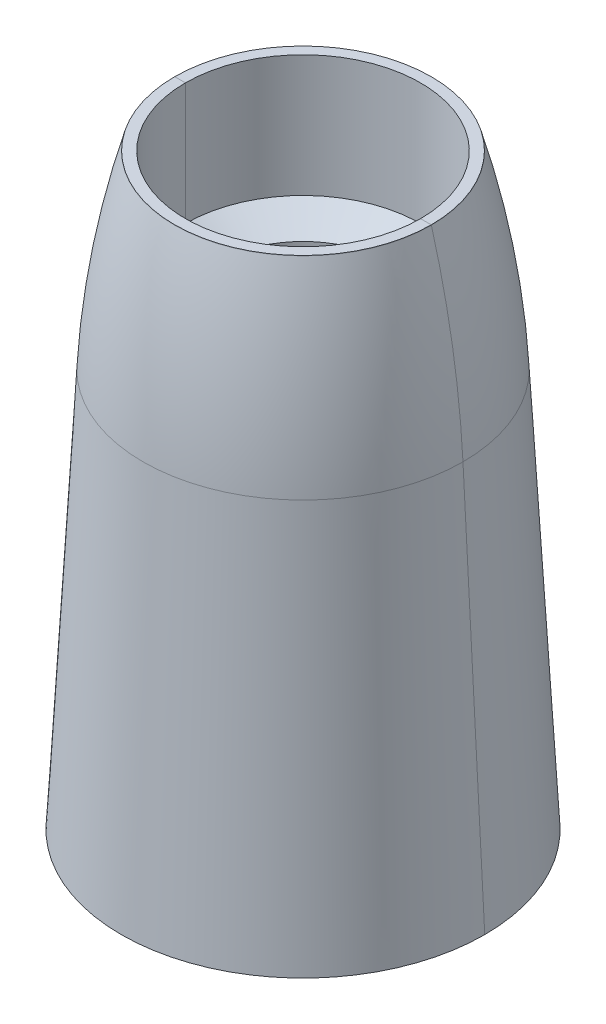
ISO-10303-21;
HEADER;
FILE_DESCRIPTION(('STEP AP214'),'2;1');
FILE_NAME('part.step','',(''),(''),'','','');
FILE_SCHEMA(('AUTOMOTIVE_DESIGN { 1 0 10303 214 1 1 1 1 }'));
ENDSEC;
DATA;
#1=APPLICATION_CONTEXT('core data for automotive mechanical design processes');
#2=APPLICATION_PROTOCOL_DEFINITION('international standard','automotive_design',2000,#1);
#3=PRODUCT_CONTEXT('',#1,'mechanical');
#4=PRODUCT('Part','Part','',(#3));
#5=PRODUCT_RELATED_PRODUCT_CATEGORY('part','',(#4));
#6=PRODUCT_DEFINITION_FORMATION('','',#4);
#7=PRODUCT_DEFINITION_CONTEXT('part definition',#1,'design');
#8=PRODUCT_DEFINITION('design','',#6,#7);
#9=PRODUCT_DEFINITION_SHAPE('','',#8);
#10=(LENGTH_UNIT() NAMED_UNIT(*) SI_UNIT(.MILLI.,.METRE.));
#11=(NAMED_UNIT(*) PLANE_ANGLE_UNIT() SI_UNIT($,.RADIAN.));
#12=(NAMED_UNIT(*) SI_UNIT($,.STERADIAN.) SOLID_ANGLE_UNIT());
#13=UNCERTAINTY_MEASURE_WITH_UNIT(LENGTH_MEASURE(1.E-05),#10,'distance_accuracy_value','');
#14=(GEOMETRIC_REPRESENTATION_CONTEXT(3) GLOBAL_UNCERTAINTY_ASSIGNED_CONTEXT((#13)) GLOBAL_UNIT_ASSIGNED_CONTEXT((#10,
#11,#12)) REPRESENTATION_CONTEXT('',''));
#15=CARTESIAN_POINT('',(0.,0.,0.));
#16=DIRECTION('',(0.,0.,1.));
#17=DIRECTION('',(1.,0.,0.));
#18=AXIS2_PLACEMENT_3D('',#15,#16,#17);
#19=CARTESIAN_POINT('',(0.,0.,0.));
#20=DIRECTION('',(0.,0.,1.));
#21=DIRECTION('',(1.,0.,0.));
#22=AXIS2_PLACEMENT_3D('',#19,#20,#21);
#23=PLANE('',#22);
#24=DIRECTION('',(-1.,0.,0.));
#25=VECTOR('',#24,1.);
#26=CARTESIAN_POINT('',(0.,0.,0.));
#27=LINE('',#26,#25);
#28=CARTESIAN_POINT('',(8.5,0.,0.));
#29=VERTEX_POINT('',#28);
#30=CARTESIAN_POINT('',(2.6,0.,0.));
#31=VERTEX_POINT('',#30);
#32=EDGE_CURVE('E192',#29,#31,#27,.T.);
#33=ORIENTED_EDGE('',*,*,#32,.F.);
#34=DIRECTION('',(-0.0545485545110783,0.998511119217384,0.));
#35=VECTOR('',#34,1.);
#36=CARTESIAN_POINT('',(0.,155.5924733372,0.));
#37=LINE('',#36,#35);
#38=CARTESIAN_POINT('',(7.48168897642754,18.6401800922559,0.));
#39=VERTEX_POINT('',#38);
#40=EDGE_CURVE('E198',#39,#29,#37,.F.);
#41=ORIENTED_EDGE('',*,*,#40,.F.);
#42=CARTESIAN_POINT('',(-32.9580113518765,16.4309636345572,0.));
#43=DIRECTION('',(0.,0.,1.));
#44=DIRECTION('',(1.,0.,0.));
#45=AXIS2_PLACEMENT_3D('',#42,#43,#44);
#46=CIRCLE('',#45,40.5);
#47=CARTESIAN_POINT('',(6.0039982347022,27.485908635567,0.));
#48=VERTEX_POINT('',#47);
#49=EDGE_CURVE('E63',#48,#39,#46,.F.);
#50=ORIENTED_EDGE('',*,*,#49,.F.);
#51=DIRECTION('',(-0.272961604963203,0.962024928063671,0.));
#52=VECTOR('',#51,1.);
#53=CARTESIAN_POINT('',(0.,48.6463790636788,0.));
#54=LINE('',#53,#52);
#55=CARTESIAN_POINT('',(6.,27.5,0.));
#56=VERTEX_POINT('',#55);
#57=EDGE_CURVE('E201',#56,#48,#54,.F.);
#58=ORIENTED_EDGE('',*,*,#57,.F.);
#59=DIRECTION('',(1.,0.,0.));
#60=VECTOR('',#59,1.);
#61=CARTESIAN_POINT('',(0.,27.5,0.));
#62=LINE('',#61,#60);
#63=CARTESIAN_POINT('',(5.5,27.5,0.));
#64=VERTEX_POINT('',#63);
#65=EDGE_CURVE('E208',#64,#56,#62,.T.);
#66=ORIENTED_EDGE('',*,*,#65,.F.);
#67=DIRECTION('',(0.,-1.,0.));
#68=VECTOR('',#67,1.);
#69=CARTESIAN_POINT('',(5.5,0.,0.));
#70=LINE('',#69,#68);
#71=CARTESIAN_POINT('',(5.5,21.8,0.));
#72=VERTEX_POINT('',#71);
#73=EDGE_CURVE('E211',#72,#64,#70,.F.);
#74=ORIENTED_EDGE('',*,*,#73,.F.);
#75=DIRECTION('',(0.88235294117647,0.470588235294118,0.));
#76=VECTOR('',#75,1.);
#77=CARTESIAN_POINT('',(0.,18.8666666666667,0.));
#78=LINE('',#77,#76);
#79=CARTESIAN_POINT('',(4.,21.,0.));
#80=VERTEX_POINT('',#79);
#81=EDGE_CURVE('E218',#80,#72,#78,.T.);
#82=ORIENTED_EDGE('',*,*,#81,.F.);
#83=DIRECTION('',(0.,-1.,0.));
#84=VECTOR('',#83,1.);
#85=CARTESIAN_POINT('',(4.,0.,0.));
#86=LINE('',#85,#84);
#87=CARTESIAN_POINT('',(4.,14.5,0.));
#88=VERTEX_POINT('',#87);
#89=EDGE_CURVE('E221',#88,#80,#86,.F.);
#90=ORIENTED_EDGE('',*,*,#89,.F.);
#91=DIRECTION('',(-0.882352941176471,0.470588235294117,0.));
#92=VECTOR('',#91,1.);
#93=CARTESIAN_POINT('',(0.,16.6333333333333,0.));
#94=LINE('',#93,#92);
#95=CARTESIAN_POINT('',(5.5,13.7,0.));
#96=VERTEX_POINT('',#95);
#97=EDGE_CURVE('E226',#96,#88,#94,.T.);
#98=ORIENTED_EDGE('',*,*,#97,.F.);
#99=DIRECTION('',(0.,-1.,0.));
#100=VECTOR('',#99,1.);
#101=CARTESIAN_POINT('',(5.5,0.,0.));
#102=LINE('',#101,#100);
#103=CARTESIAN_POINT('',(5.5,8.,0.));
#104=VERTEX_POINT('',#103);
#105=EDGE_CURVE('E231',#104,#96,#102,.F.);
#106=ORIENTED_EDGE('',*,*,#105,.F.);
#107=DIRECTION('',(1.,0.,0.));
#108=VECTOR('',#107,1.);
#109=CARTESIAN_POINT('',(0.,8.,0.));
#110=LINE('',#109,#108);
#111=CARTESIAN_POINT('',(2.6,8.,0.));
#112=VERTEX_POINT('',#111);
#113=EDGE_CURVE('E149',#112,#104,#110,.T.);
#114=ORIENTED_EDGE('',*,*,#113,.F.);
#115=DIRECTION('',(0.,-1.,0.));
#116=VECTOR('',#115,1.);
#117=CARTESIAN_POINT('',(2.6,0.,0.));
#118=LINE('',#117,#116);
#119=EDGE_CURVE('E150',#31,#112,#118,.F.);
#120=ORIENTED_EDGE('',*,*,#119,.F.);
#121=EDGE_LOOP('',(#33,#41,#50,#58,#66,#74,#82,#90,#98,#106,#114,#120));
#122=FACE_BOUND('',#121,.T.);
#123=ADVANCED_FACE('F48',(#122),#23,.T.);
#124=CARTESIAN_POINT('',(-2.6,0.,0.));
#125=VERTEX_POINT('',#124);
#126=CARTESIAN_POINT('',(-8.5,0.,0.));
#127=VERTEX_POINT('',#126);
#128=EDGE_CURVE('E156',#125,#127,#27,.T.);
#129=ORIENTED_EDGE('',*,*,#128,.F.);
#130=DIRECTION('',(0.,-1.,0.));
#131=VECTOR('',#130,1.);
#132=CARTESIAN_POINT('',(-2.6,0.,0.));
#133=LINE('',#132,#131);
#134=CARTESIAN_POINT('',(-2.6,8.,0.));
#135=VERTEX_POINT('',#134);
#136=EDGE_CURVE('E153',#135,#125,#133,.T.);
#137=ORIENTED_EDGE('',*,*,#136,.F.);
#138=CARTESIAN_POINT('',(-5.5,8.,0.));
#139=VERTEX_POINT('',#138);
#140=EDGE_CURVE('E139',#139,#135,#110,.T.);
#141=ORIENTED_EDGE('',*,*,#140,.F.);
#142=DIRECTION('',(0.,-1.,0.));
#143=VECTOR('',#142,1.);
#144=CARTESIAN_POINT('',(-5.5,0.,0.));
#145=LINE('',#144,#143);
#146=CARTESIAN_POINT('',(-5.5,13.7,0.));
#147=VERTEX_POINT('',#146);
#148=EDGE_CURVE('E234',#147,#139,#145,.T.);
#149=ORIENTED_EDGE('',*,*,#148,.F.);
#150=DIRECTION('',(-0.882352941176471,-0.470588235294117,0.));
#151=VECTOR('',#150,1.);
#152=CARTESIAN_POINT('',(0.,16.6333333333333,0.));
#153=LINE('',#152,#151);
#154=CARTESIAN_POINT('',(-4.,14.5,0.));
#155=VERTEX_POINT('',#154);
#156=EDGE_CURVE('E229',#155,#147,#153,.T.);
#157=ORIENTED_EDGE('',*,*,#156,.F.);
#158=DIRECTION('',(0.,-1.,0.));
#159=VECTOR('',#158,1.);
#160=CARTESIAN_POINT('',(-4.,0.,0.));
#161=LINE('',#160,#159);
#162=CARTESIAN_POINT('',(-4.,21.,0.));
#163=VERTEX_POINT('',#162);
#164=EDGE_CURVE('E224',#163,#155,#161,.T.);
#165=ORIENTED_EDGE('',*,*,#164,.F.);
#166=DIRECTION('',(0.88235294117647,-0.470588235294118,0.));
#167=VECTOR('',#166,1.);
#168=CARTESIAN_POINT('',(0.,18.8666666666667,0.));
#169=LINE('',#168,#167);
#170=CARTESIAN_POINT('',(-5.5,21.8,0.));
#171=VERTEX_POINT('',#170);
#172=EDGE_CURVE('E216',#171,#163,#169,.T.);
#173=ORIENTED_EDGE('',*,*,#172,.F.);
#174=DIRECTION('',(0.,-1.,0.));
#175=VECTOR('',#174,1.);
#176=CARTESIAN_POINT('',(-5.5,0.,0.));
#177=LINE('',#176,#175);
#178=CARTESIAN_POINT('',(-5.5,27.5,0.));
#179=VERTEX_POINT('',#178);
#180=EDGE_CURVE('E214',#179,#171,#177,.T.);
#181=ORIENTED_EDGE('',*,*,#180,.F.);
#182=CARTESIAN_POINT('',(-6.,27.5,0.));
#183=VERTEX_POINT('',#182);
#184=EDGE_CURVE('E209',#183,#179,#62,.T.);
#185=ORIENTED_EDGE('',*,*,#184,.F.);
#186=DIRECTION('',(-0.272961604963203,-0.962024928063671,0.));
#187=VECTOR('',#186,1.);
#188=CARTESIAN_POINT('',(0.,48.6463790636788,0.));
#189=LINE('',#188,#187);
#190=CARTESIAN_POINT('',(-6.0039982347022,27.485908635567,0.));
#191=VERTEX_POINT('',#190);
#192=EDGE_CURVE('E206',#191,#183,#189,.F.);
#193=ORIENTED_EDGE('',*,*,#192,.F.);
#194=CARTESIAN_POINT('',(32.9580113518765,16.4309636345572,0.));
#195=DIRECTION('',(0.,0.,1.));
#196=DIRECTION('',(1.,0.,0.));
#197=AXIS2_PLACEMENT_3D('',#194,#195,#196);
#198=CIRCLE('',#197,40.5);
#199=CARTESIAN_POINT('',(-7.48168897642754,18.6401800922559,0.));
#200=VERTEX_POINT('',#199);
#201=EDGE_CURVE('E71',#200,#191,#198,.F.);
#202=ORIENTED_EDGE('',*,*,#201,.F.);
#203=DIRECTION('',(-0.0545485545110783,-0.998511119217384,0.));
#204=VECTOR('',#203,1.);
#205=CARTESIAN_POINT('',(0.,155.5924733372,0.));
#206=LINE('',#205,#204);
#207=EDGE_CURVE('E197',#127,#200,#206,.F.);
#208=ORIENTED_EDGE('',*,*,#207,.F.);
#209=EDGE_LOOP('',(#129,#137,#141,#149,#157,#165,#173,#181,#185,#193,#202,#208));
#210=FACE_BOUND('',#209,.T.);
#211=ADVANCED_FACE('F154',(#210),#23,.T.);
#212=CARTESIAN_POINT('',(0.,8.,-2.6));
#213=DIRECTION('',(0.,1.,0.));
#214=DIRECTION('',(0.,0.,1.));
#215=AXIS2_PLACEMENT_3D('',#212,#213,#214);
#216=PLANE('',#215);
#217=CARTESIAN_POINT('',(0.,8.,0.));
#218=DIRECTION('',(0.,-1.,0.));
#219=DIRECTION('',(0.,0.,-1.));
#220=AXIS2_PLACEMENT_3D('',#217,#218,#219);
#221=CIRCLE('',#220,5.5);
#222=EDGE_CURVE('E146',#139,#104,#221,.T.);
#223=ORIENTED_EDGE('',*,*,#222,.F.);
#224=ORIENTED_EDGE('',*,*,#140,.T.);
#225=CARTESIAN_POINT('',(0.,8.,0.));
#226=DIRECTION('',(0.,-1.,0.));
#227=DIRECTION('',(0.,0.,-1.));
#228=AXIS2_PLACEMENT_3D('',#225,#226,#227);
#229=CIRCLE('',#228,2.6);
#230=EDGE_CURVE('E144',#135,#112,#229,.T.);
#231=ORIENTED_EDGE('',*,*,#230,.T.);
#232=ORIENTED_EDGE('',*,*,#113,.T.);
#233=EDGE_LOOP('',(#223,#224,#231,#232));
#234=FACE_BOUND('',#233,.T.);
#235=ADVANCED_FACE('F141',(#234),#216,.T.);
#236=CARTESIAN_POINT('',(0.,0.,0.));
#237=DIRECTION('',(0.,-1.,0.));
#238=DIRECTION('',(0.,0.,-1.));
#239=AXIS2_PLACEMENT_3D('',#236,#237,#238);
#240=CYLINDRICAL_SURFACE('',#239,5.5);
#241=CARTESIAN_POINT('',(0.,13.7,0.));
#242=DIRECTION('',(0.,-1.,0.));
#243=DIRECTION('',(0.,0.,-1.));
#244=AXIS2_PLACEMENT_3D('',#241,#242,#243);
#245=CIRCLE('',#244,5.5);
#246=EDGE_CURVE('E165',#147,#96,#245,.T.);
#247=ORIENTED_EDGE('',*,*,#246,.F.);
#248=ORIENTED_EDGE('',*,*,#148,.T.);
#249=ORIENTED_EDGE('',*,*,#222,.T.);
#250=ORIENTED_EDGE('',*,*,#105,.T.);
#251=EDGE_LOOP('',(#247,#248,#249,#250));
#252=FACE_BOUND('',#251,.T.);
#253=ADVANCED_FACE('F247',(#252),#240,.F.);
#254=CARTESIAN_POINT('',(0.,14.5,0.));
#255=DIRECTION('',(0.,-1.,0.));
#256=DIRECTION('',(0.,0.,-1.));
#257=AXIS2_PLACEMENT_3D('',#254,#255,#256);
#258=CONICAL_SURFACE('',#257,4.,1.08083900054117);
#259=CARTESIAN_POINT('',(0.,14.5,0.));
#260=DIRECTION('',(0.,-1.,0.));
#261=DIRECTION('',(0.,0.,-1.));
#262=AXIS2_PLACEMENT_3D('',#259,#260,#261);
#263=CIRCLE('',#262,4.);
#264=EDGE_CURVE('E174',#155,#88,#263,.T.);
#265=ORIENTED_EDGE('',*,*,#264,.F.);
#266=ORIENTED_EDGE('',*,*,#156,.T.);
#267=ORIENTED_EDGE('',*,*,#246,.T.);
#268=ORIENTED_EDGE('',*,*,#97,.T.);
#269=EDGE_LOOP('',(#265,#266,#267,#268));
#270=FACE_BOUND('',#269,.T.);
#271=ADVANCED_FACE('F253',(#270),#258,.F.);
#272=CARTESIAN_POINT('',(0.,0.,0.));
#273=DIRECTION('',(0.,-1.,0.));
#274=DIRECTION('',(0.,0.,-1.));
#275=AXIS2_PLACEMENT_3D('',#272,#273,#274);
#276=CYLINDRICAL_SURFACE('',#275,4.);
#277=CARTESIAN_POINT('',(0.,21.,0.));
#278=DIRECTION('',(0.,-1.,0.));
#279=DIRECTION('',(0.,0.,-1.));
#280=AXIS2_PLACEMENT_3D('',#277,#278,#279);
#281=CIRCLE('',#280,4.);
#282=EDGE_CURVE('E177',#163,#80,#281,.T.);
#283=ORIENTED_EDGE('',*,*,#282,.F.);
#284=ORIENTED_EDGE('',*,*,#164,.T.);
#285=ORIENTED_EDGE('',*,*,#264,.T.);
#286=ORIENTED_EDGE('',*,*,#89,.T.);
#287=EDGE_LOOP('',(#283,#284,#285,#286));
#288=FACE_BOUND('',#287,.T.);
#289=ADVANCED_FACE('F261',(#288),#276,.F.);
#290=CARTESIAN_POINT('',(0.,21.8,0.));
#291=DIRECTION('',(0.,1.,0.));
#292=DIRECTION('',(0.,0.,1.));
#293=AXIS2_PLACEMENT_3D('',#290,#291,#292);
#294=CONICAL_SURFACE('',#293,5.5,1.08083900054117);
#295=ORIENTED_EDGE('',*,*,#282,.T.);
#296=ORIENTED_EDGE('',*,*,#81,.T.);
#297=CARTESIAN_POINT('',(0.,21.8,0.));
#298=DIRECTION('',(0.,-1.,0.));
#299=DIRECTION('',(0.,0.,-1.));
#300=AXIS2_PLACEMENT_3D('',#297,#298,#299);
#301=CIRCLE('',#300,5.5);
#302=EDGE_CURVE('E180',#171,#72,#301,.T.);
#303=ORIENTED_EDGE('',*,*,#302,.F.);
#304=ORIENTED_EDGE('',*,*,#172,.T.);
#305=EDGE_LOOP('',(#295,#296,#303,#304));
#306=FACE_BOUND('',#305,.T.);
#307=ADVANCED_FACE('F265',(#306),#294,.F.);
#308=CARTESIAN_POINT('',(0.,0.,0.));
#309=DIRECTION('',(0.,-1.,0.));
#310=DIRECTION('',(0.,0.,-1.));
#311=AXIS2_PLACEMENT_3D('',#308,#309,#310);
#312=CYLINDRICAL_SURFACE('',#311,5.5);
#313=CARTESIAN_POINT('',(0.,27.5,0.));
#314=DIRECTION('',(0.,-1.,0.));
#315=DIRECTION('',(0.,0.,-1.));
#316=AXIS2_PLACEMENT_3D('',#313,#314,#315);
#317=CIRCLE('',#316,5.5);
#318=EDGE_CURVE('E183',#179,#64,#317,.T.);
#319=ORIENTED_EDGE('',*,*,#318,.F.);
#320=ORIENTED_EDGE('',*,*,#180,.T.);
#321=ORIENTED_EDGE('',*,*,#302,.T.);
#322=ORIENTED_EDGE('',*,*,#73,.T.);
#323=EDGE_LOOP('',(#319,#320,#321,#322));
#324=FACE_BOUND('',#323,.T.);
#325=ADVANCED_FACE('F269',(#324),#312,.F.);
#326=CARTESIAN_POINT('',(0.,27.5,-5.5));
#327=DIRECTION('',(0.,1.,0.));
#328=DIRECTION('',(0.,0.,1.));
#329=AXIS2_PLACEMENT_3D('',#326,#327,#328);
#330=PLANE('',#329);
#331=CARTESIAN_POINT('',(0.,27.5,0.));
#332=DIRECTION('',(0.,-1.,0.));
#333=DIRECTION('',(0.,0.,-1.));
#334=AXIS2_PLACEMENT_3D('',#331,#332,#333);
#335=CIRCLE('',#334,6.);
#336=EDGE_CURVE('E186',#183,#56,#335,.T.);
#337=ORIENTED_EDGE('',*,*,#336,.F.);
#338=ORIENTED_EDGE('',*,*,#184,.T.);
#339=ORIENTED_EDGE('',*,*,#318,.T.);
#340=ORIENTED_EDGE('',*,*,#65,.T.);
#341=EDGE_LOOP('',(#337,#338,#339,#340));
#342=FACE_BOUND('',#341,.T.);
#343=ADVANCED_FACE('F273',(#342),#330,.T.);
#344=CARTESIAN_POINT('',(0.,0.,0.));
#345=DIRECTION('',(0.,-1.,0.));
#346=DIRECTION('',(0.,0.,-1.));
#347=AXIS2_PLACEMENT_3D('',#344,#345,#346);
#348=CYLINDRICAL_SURFACE('',#347,2.6);
#349=ORIENTED_EDGE('',*,*,#230,.F.);
#350=ORIENTED_EDGE('',*,*,#136,.T.);
#351=CARTESIAN_POINT('',(0.,0.,0.));
#352=DIRECTION('',(0.,-1.,0.));
#353=DIRECTION('',(0.,0.,-1.));
#354=AXIS2_PLACEMENT_3D('',#351,#352,#353);
#355=CIRCLE('',#354,2.6);
#356=EDGE_CURVE('E12',#125,#31,#355,.T.);
#357=ORIENTED_EDGE('',*,*,#356,.T.);
#358=ORIENTED_EDGE('',*,*,#119,.T.);
#359=EDGE_LOOP('',(#349,#350,#357,#358));
#360=FACE_BOUND('',#359,.T.);
#361=ADVANCED_FACE('F161',(#360),#348,.F.);
#362=CARTESIAN_POINT('',(0.,0.,0.));
#363=DIRECTION('',(0.,-1.,0.));
#364=DIRECTION('',(0.,0.,-1.));
#365=AXIS2_PLACEMENT_3D('',#362,#363,#364);
#366=CONICAL_SURFACE('',#365,8.5,0.0545756427424007);
#367=CARTESIAN_POINT('',(0.,0.,0.));
#368=DIRECTION('',(0.,-1.,0.));
#369=DIRECTION('',(0.,0.,-1.));
#370=AXIS2_PLACEMENT_3D('',#367,#368,#369);
#371=CIRCLE('',#370,8.5);
#372=EDGE_CURVE('E56',#127,#29,#371,.T.);
#373=ORIENTED_EDGE('',*,*,#372,.F.);
#374=ORIENTED_EDGE('',*,*,#207,.T.);
#375=CARTESIAN_POINT('',(0.,18.6401800922559,0.));
#376=DIRECTION('',(0.,1.,0.));
#377=DIRECTION('',(0.,0.,1.));
#378=AXIS2_PLACEMENT_3D('',#375,#376,#377);
#379=CIRCLE('',#378,7.48168897642754);
#380=EDGE_CURVE('E163',#200,#39,#379,.F.);
#381=ORIENTED_EDGE('',*,*,#380,.T.);
#382=ORIENTED_EDGE('',*,*,#40,.T.);
#383=EDGE_LOOP('',(#373,#374,#381,#382));
#384=FACE_BOUND('',#383,.T.);
#385=ADVANCED_FACE('F196',(#384),#366,.T.);
#386=CARTESIAN_POINT('',(0.,23.1453552561219,0.));
#387=DIRECTION('',(0.,-1.,0.));
#388=DIRECTION('',(0.,0.,-1.));
#389=AXIS2_PLACEMENT_3D('',#386,#387,#388);
#390=CONICAL_SURFACE('',#389,7.23557174420211,0.276470204640159);
#391=CARTESIAN_POINT('',(0.,27.485908635567,0.));
#392=DIRECTION('',(0.,1.,0.));
#393=DIRECTION('',(0.,0.,1.));
#394=AXIS2_PLACEMENT_3D('',#391,#392,#393);
#395=CIRCLE('',#394,6.0039982347022);
#396=EDGE_CURVE('E168',#48,#191,#395,.T.);
#397=ORIENTED_EDGE('',*,*,#396,.T.);
#398=ORIENTED_EDGE('',*,*,#192,.T.);
#399=ORIENTED_EDGE('',*,*,#336,.T.);
#400=ORIENTED_EDGE('',*,*,#57,.T.);
#401=EDGE_LOOP('',(#397,#398,#399,#400));
#402=FACE_BOUND('',#401,.T.);
#403=ADVANCED_FACE('F240',(#402),#390,.T.);
#404=CARTESIAN_POINT('',(0.,16.4309636345572,0.));
#405=DIRECTION('',(0.,1.,0.));
#406=DIRECTION('',(0.,0.,1.));
#407=AXIS2_PLACEMENT_3D('',#404,#405,#406);
#408=DEGENERATE_TOROIDAL_SURFACE('',#407,32.9580113518765,40.5,.F.);
#409=ORIENTED_EDGE('',*,*,#396,.F.);
#410=ORIENTED_EDGE('',*,*,#49,.T.);
#411=ORIENTED_EDGE('',*,*,#380,.F.);
#412=ORIENTED_EDGE('',*,*,#201,.T.);
#413=EDGE_LOOP('',(#409,#410,#411,#412));
#414=FACE_BOUND('',#413,.T.);
#415=ADVANCED_FACE('F50',(#414),#408,.F.);
#416=CARTESIAN_POINT('',(0.,0.,-2.6));
#417=DIRECTION('',(0.,-1.,0.));
#418=DIRECTION('',(0.,0.,-1.));
#419=AXIS2_PLACEMENT_3D('',#416,#417,#418);
#420=PLANE('',#419);
#421=ORIENTED_EDGE('',*,*,#372,.T.);
#422=ORIENTED_EDGE('',*,*,#32,.T.);
#423=ORIENTED_EDGE('',*,*,#356,.F.);
#424=ORIENTED_EDGE('',*,*,#128,.T.);
#425=EDGE_LOOP('',(#421,#422,#423,#424));
#426=FACE_BOUND('',#425,.T.);
#427=ADVANCED_FACE('F191',(#426),#420,.T.);
#428=CLOSED_SHELL('',(#123,#211,#235,#253,#271,#289,#307,#325,#343,#361,#385,#403,#415,#427));
#429=MANIFOLD_SOLID_BREP('B2',#428);
#430=CARTESIAN_POINT('',(0.,0.,0.));
#431=DIRECTION('',(0.,0.,1.));
#432=DIRECTION('',(1.,0.,0.));
#433=AXIS2_PLACEMENT_3D('',#430,#431,#432);
#434=PLANE('',#433);
#435=DIRECTION('',(-1.,0.,0.));
#436=VECTOR('',#435,1.);
#437=CARTESIAN_POINT('',(0.,0.,0.));
#438=LINE('',#437,#436);
#439=CARTESIAN_POINT('',(8.5,0.,0.));
#440=VERTEX_POINT('',#439);
#441=CARTESIAN_POINT('',(2.6,0.,0.));
#442=VERTEX_POINT('',#441);
#443=EDGE_CURVE('E584',#440,#442,#438,.T.);
#444=ORIENTED_EDGE('',*,*,#443,.T.);
#445=DIRECTION('',(0.,-1.,0.));
#446=VECTOR('',#445,1.);
#447=CARTESIAN_POINT('',(2.6,0.,0.));
#448=LINE('',#447,#446);
#449=CARTESIAN_POINT('',(2.6,8.,0.));
#450=VERTEX_POINT('',#449);
#451=EDGE_CURVE('E431',#442,#450,#448,.F.);
#452=ORIENTED_EDGE('',*,*,#451,.T.);
#453=DIRECTION('',(1.,0.,0.));
#454=VECTOR('',#453,1.);
#455=CARTESIAN_POINT('',(0.,8.,0.));
#456=LINE('',#455,#454);
#457=CARTESIAN_POINT('',(5.5,8.,0.));
#458=VERTEX_POINT('',#457);
#459=EDGE_CURVE('E539',#450,#458,#456,.T.);
#460=ORIENTED_EDGE('',*,*,#459,.T.);
#461=DIRECTION('',(0.,-1.,0.));
#462=VECTOR('',#461,1.);
#463=CARTESIAN_POINT('',(5.5,0.,0.));
#464=LINE('',#463,#462);
#465=CARTESIAN_POINT('',(5.5,13.7,0.));
#466=VERTEX_POINT('',#465);
#467=EDGE_CURVE('E581',#458,#466,#464,.F.);
#468=ORIENTED_EDGE('',*,*,#467,.T.);
#469=DIRECTION('',(-0.882352941176471,0.470588235294117,0.));
#470=VECTOR('',#469,1.);
#471=CARTESIAN_POINT('',(0.,16.6333333333333,0.));
#472=LINE('',#471,#470);
#473=CARTESIAN_POINT('',(4.,14.5,0.));
#474=VERTEX_POINT('',#473);
#475=EDGE_CURVE('E578',#466,#474,#472,.T.);
#476=ORIENTED_EDGE('',*,*,#475,.T.);
#477=DIRECTION('',(0.,-1.,0.));
#478=VECTOR('',#477,1.);
#479=CARTESIAN_POINT('',(4.,0.,0.));
#480=LINE('',#479,#478);
#481=CARTESIAN_POINT('',(4.,21.,0.));
#482=VERTEX_POINT('',#481);
#483=EDGE_CURVE('E577',#474,#482,#480,.F.);
#484=ORIENTED_EDGE('',*,*,#483,.T.);
#485=DIRECTION('',(0.88235294117647,0.470588235294118,0.));
#486=VECTOR('',#485,1.);
#487=CARTESIAN_POINT('',(0.,18.8666666666667,0.));
#488=LINE('',#487,#486);
#489=CARTESIAN_POINT('',(5.5,21.8,0.));
#490=VERTEX_POINT('',#489);
#491=EDGE_CURVE('E573',#482,#490,#488,.T.);
#492=ORIENTED_EDGE('',*,*,#491,.T.);
#493=DIRECTION('',(0.,-1.,0.));
#494=VECTOR('',#493,1.);
#495=CARTESIAN_POINT('',(5.5,0.,0.));
#496=LINE('',#495,#494);
#497=CARTESIAN_POINT('',(5.5,27.5,0.));
#498=VERTEX_POINT('',#497);
#499=EDGE_CURVE('E569',#490,#498,#496,.F.);
#500=ORIENTED_EDGE('',*,*,#499,.T.);
#501=DIRECTION('',(1.,0.,0.));
#502=VECTOR('',#501,1.);
#503=CARTESIAN_POINT('',(0.,27.5,0.));
#504=LINE('',#503,#502);
#505=CARTESIAN_POINT('',(6.,27.5,0.));
#506=VERTEX_POINT('',#505);
#507=EDGE_CURVE('E562',#498,#506,#504,.T.);
#508=ORIENTED_EDGE('',*,*,#507,.T.);
#509=DIRECTION('',(-0.272961604963203,0.962024928063671,0.));
#510=VECTOR('',#509,1.);
#511=CARTESIAN_POINT('',(0.,48.6463790636788,0.));
#512=LINE('',#511,#510);
#513=CARTESIAN_POINT('',(6.0039982347022,27.485908635567,0.));
#514=VERTEX_POINT('',#513);
#515=EDGE_CURVE('E560',#506,#514,#512,.F.);
#516=ORIENTED_EDGE('',*,*,#515,.T.);
#517=CARTESIAN_POINT('',(-32.9580113518765,16.4309636345572,0.));
#518=DIRECTION('',(0.,0.,1.));
#519=DIRECTION('',(1.,0.,0.));
#520=AXIS2_PLACEMENT_3D('',#517,#518,#519);
#521=CIRCLE('',#520,40.5);
#522=CARTESIAN_POINT('',(7.48168897642754,18.6401800922559,0.));
#523=VERTEX_POINT('',#522);
#524=EDGE_CURVE('E436',#514,#523,#521,.F.);
#525=ORIENTED_EDGE('',*,*,#524,.T.);
#526=DIRECTION('',(-0.0545485545110783,0.998511119217384,0.));
#527=VECTOR('',#526,1.);
#528=CARTESIAN_POINT('',(0.,155.5924733372,0.));
#529=LINE('',#528,#527);
#530=EDGE_CURVE('E559',#523,#440,#529,.F.);
#531=ORIENTED_EDGE('',*,*,#530,.T.);
#532=EDGE_LOOP('',(#444,#452,#460,#468,#476,#484,#492,#500,#508,#516,#525,#531));
#533=FACE_BOUND('',#532,.T.);
#534=ADVANCED_FACE('F427',(#533),#434,.F.);
#535=CARTESIAN_POINT('',(-2.6,0.,0.));
#536=VERTEX_POINT('',#535);
#537=CARTESIAN_POINT('',(-8.5,0.,0.));
#538=VERTEX_POINT('',#537);
#539=EDGE_CURVE('E555',#536,#538,#438,.T.);
#540=ORIENTED_EDGE('',*,*,#539,.T.);
#541=DIRECTION('',(-0.0545485545110783,-0.998511119217384,0.));
#542=VECTOR('',#541,1.);
#543=CARTESIAN_POINT('',(0.,155.5924733372,0.));
#544=LINE('',#543,#542);
#545=CARTESIAN_POINT('',(-7.48168897642754,18.6401800922559,0.));
#546=VERTEX_POINT('',#545);
#547=EDGE_CURVE('E556',#538,#546,#544,.F.);
#548=ORIENTED_EDGE('',*,*,#547,.T.);
#549=CARTESIAN_POINT('',(32.9580113518765,16.4309636345572,0.));
#550=DIRECTION('',(0.,0.,1.));
#551=DIRECTION('',(1.,0.,0.));
#552=AXIS2_PLACEMENT_3D('',#549,#550,#551);
#553=CIRCLE('',#552,40.5);
#554=CARTESIAN_POINT('',(-6.0039982347022,27.485908635567,0.));
#555=VERTEX_POINT('',#554);
#556=EDGE_CURVE('E46',#546,#555,#553,.F.);
#557=ORIENTED_EDGE('',*,*,#556,.T.);
#558=DIRECTION('',(-0.272961604963203,-0.962024928063671,0.));
#559=VECTOR('',#558,1.);
#560=CARTESIAN_POINT('',(0.,48.6463790636788,0.));
#561=LINE('',#560,#559);
#562=CARTESIAN_POINT('',(-6.,27.5,0.));
#563=VERTEX_POINT('',#562);
#564=EDGE_CURVE('E451',#555,#563,#561,.F.);
#565=ORIENTED_EDGE('',*,*,#564,.T.);
#566=CARTESIAN_POINT('',(-5.5,27.5,0.));
#567=VERTEX_POINT('',#566);
#568=EDGE_CURVE('E565',#563,#567,#504,.T.);
#569=ORIENTED_EDGE('',*,*,#568,.T.);
#570=DIRECTION('',(0.,-1.,0.));
#571=VECTOR('',#570,1.);
#572=CARTESIAN_POINT('',(-5.5,0.,0.));
#573=LINE('',#572,#571);
#574=CARTESIAN_POINT('',(-5.5,21.8,0.));
#575=VERTEX_POINT('',#574);
#576=EDGE_CURVE('E566',#567,#575,#573,.T.);
#577=ORIENTED_EDGE('',*,*,#576,.T.);
#578=DIRECTION('',(0.88235294117647,-0.470588235294118,0.));
#579=VECTOR('',#578,1.);
#580=CARTESIAN_POINT('',(0.,18.8666666666667,0.));
#581=LINE('',#580,#579);
#582=CARTESIAN_POINT('',(-4.,21.,0.));
#583=VERTEX_POINT('',#582);
#584=EDGE_CURVE('E570',#575,#583,#581,.T.);
#585=ORIENTED_EDGE('',*,*,#584,.T.);
#586=DIRECTION('',(0.,-1.,0.));
#587=VECTOR('',#586,1.);
#588=CARTESIAN_POINT('',(-4.,0.,0.));
#589=LINE('',#588,#587);
#590=CARTESIAN_POINT('',(-4.,14.5,0.));
#591=VERTEX_POINT('',#590);
#592=EDGE_CURVE('E574',#583,#591,#589,.T.);
#593=ORIENTED_EDGE('',*,*,#592,.T.);
#594=DIRECTION('',(-0.882352941176471,-0.470588235294117,0.));
#595=VECTOR('',#594,1.);
#596=CARTESIAN_POINT('',(0.,16.6333333333333,0.));
#597=LINE('',#596,#595);
#598=CARTESIAN_POINT('',(-5.5,13.7,0.));
#599=VERTEX_POINT('',#598);
#600=EDGE_CURVE('E579',#591,#599,#597,.T.);
#601=ORIENTED_EDGE('',*,*,#600,.T.);
#602=DIRECTION('',(0.,-1.,0.));
#603=VECTOR('',#602,1.);
#604=CARTESIAN_POINT('',(-5.5,0.,0.));
#605=LINE('',#604,#603);
#606=CARTESIAN_POINT('',(-5.5,8.,0.));
#607=VERTEX_POINT('',#606);
#608=EDGE_CURVE('E535',#599,#607,#605,.T.);
#609=ORIENTED_EDGE('',*,*,#608,.T.);
#610=CARTESIAN_POINT('',(-2.6,8.,0.));
#611=VERTEX_POINT('',#610);
#612=EDGE_CURVE('E533',#607,#611,#456,.T.);
#613=ORIENTED_EDGE('',*,*,#612,.T.);
#614=DIRECTION('',(0.,-1.,0.));
#615=VECTOR('',#614,1.);
#616=CARTESIAN_POINT('',(-2.6,0.,0.));
#617=LINE('',#616,#615);
#618=EDGE_CURVE('E520',#611,#536,#617,.T.);
#619=ORIENTED_EDGE('',*,*,#618,.T.);
#620=EDGE_LOOP('',(#540,#548,#557,#565,#569,#577,#585,#593,#601,#609,#613,#619));
#621=FACE_BOUND('',#620,.T.);
#622=ADVANCED_FACE('F429',(#621),#434,.F.);
#623=CARTESIAN_POINT('',(0.,0.,0.));
#624=DIRECTION('',(0.,-1.,0.));
#625=DIRECTION('',(0.,0.,-1.));
#626=AXIS2_PLACEMENT_3D('',#623,#624,#625);
#627=CYLINDRICAL_SURFACE('',#626,2.6);
#628=ORIENTED_EDGE('',*,*,#618,.F.);
#629=CARTESIAN_POINT('',(0.,8.,0.));
#630=DIRECTION('',(0.,-1.,0.));
#631=DIRECTION('',(0.,0.,-1.));
#632=AXIS2_PLACEMENT_3D('',#629,#630,#631);
#633=CIRCLE('',#632,2.6);
#634=EDGE_CURVE('E524',#450,#611,#633,.T.);
#635=ORIENTED_EDGE('',*,*,#634,.F.);
#636=ORIENTED_EDGE('',*,*,#451,.F.);
#637=CARTESIAN_POINT('',(0.,0.,0.));
#638=DIRECTION('',(0.,-1.,0.));
#639=DIRECTION('',(0.,0.,-1.));
#640=AXIS2_PLACEMENT_3D('',#637,#638,#639);
#641=CIRCLE('',#640,2.6);
#642=EDGE_CURVE('E526',#442,#536,#641,.T.);
#643=ORIENTED_EDGE('',*,*,#642,.T.);
#644=EDGE_LOOP('',(#628,#635,#636,#643));
#645=FACE_BOUND('',#644,.T.);
#646=ADVANCED_FACE('F522',(#645),#627,.F.);
#647=CARTESIAN_POINT('',(0.,8.,-2.6));
#648=DIRECTION('',(0.,1.,0.));
#649=DIRECTION('',(0.,0.,1.));
#650=AXIS2_PLACEMENT_3D('',#647,#648,#649);
#651=PLANE('',#650);
#652=ORIENTED_EDGE('',*,*,#612,.F.);
#653=CARTESIAN_POINT('',(0.,8.,0.));
#654=DIRECTION('',(0.,-1.,0.));
#655=DIRECTION('',(0.,0.,-1.));
#656=AXIS2_PLACEMENT_3D('',#653,#654,#655);
#657=CIRCLE('',#656,5.5);
#658=EDGE_CURVE('E545',#458,#607,#657,.T.);
#659=ORIENTED_EDGE('',*,*,#658,.F.);
#660=ORIENTED_EDGE('',*,*,#459,.F.);
#661=ORIENTED_EDGE('',*,*,#634,.T.);
#662=EDGE_LOOP('',(#652,#659,#660,#661));
#663=FACE_BOUND('',#662,.T.);
#664=ADVANCED_FACE('F541',(#663),#651,.T.);
#665=CARTESIAN_POINT('',(0.,0.,0.));
#666=DIRECTION('',(0.,-1.,0.));
#667=DIRECTION('',(0.,0.,-1.));
#668=AXIS2_PLACEMENT_3D('',#665,#666,#667);
#669=CYLINDRICAL_SURFACE('',#668,5.5);
#670=ORIENTED_EDGE('',*,*,#608,.F.);
#671=CARTESIAN_POINT('',(0.,13.7,0.));
#672=DIRECTION('',(0.,-1.,0.));
#673=DIRECTION('',(0.,0.,-1.));
#674=AXIS2_PLACEMENT_3D('',#671,#672,#673);
#675=CIRCLE('',#674,5.5);
#676=EDGE_CURVE('E549',#466,#599,#675,.T.);
#677=ORIENTED_EDGE('',*,*,#676,.F.);
#678=ORIENTED_EDGE('',*,*,#467,.F.);
#679=ORIENTED_EDGE('',*,*,#658,.T.);
#680=EDGE_LOOP('',(#670,#677,#678,#679));
#681=FACE_BOUND('',#680,.T.);
#682=ADVANCED_FACE('F601',(#681),#669,.F.);
#683=CARTESIAN_POINT('',(0.,14.5,0.));
#684=DIRECTION('',(0.,-1.,0.));
#685=DIRECTION('',(0.,0.,-1.));
#686=AXIS2_PLACEMENT_3D('',#683,#684,#685);
#687=CONICAL_SURFACE('',#686,4.,1.08083900054117);
#688=ORIENTED_EDGE('',*,*,#600,.F.);
#689=CARTESIAN_POINT('',(0.,14.5,0.));
#690=DIRECTION('',(0.,-1.,0.));
#691=DIRECTION('',(0.,0.,-1.));
#692=AXIS2_PLACEMENT_3D('',#689,#690,#691);
#693=CIRCLE('',#692,4.);
#694=EDGE_CURVE('E603',#474,#591,#693,.T.);
#695=ORIENTED_EDGE('',*,*,#694,.F.);
#696=ORIENTED_EDGE('',*,*,#475,.F.);
#697=ORIENTED_EDGE('',*,*,#676,.T.);
#698=EDGE_LOOP('',(#688,#695,#696,#697));
#699=FACE_BOUND('',#698,.T.);
#700=ADVANCED_FACE('F642',(#699),#687,.F.);
#701=CARTESIAN_POINT('',(0.,0.,0.));
#702=DIRECTION('',(0.,-1.,0.));
#703=DIRECTION('',(0.,0.,-1.));
#704=AXIS2_PLACEMENT_3D('',#701,#702,#703);
#705=CYLINDRICAL_SURFACE('',#704,4.);
#706=ORIENTED_EDGE('',*,*,#592,.F.);
#707=CARTESIAN_POINT('',(0.,21.,0.));
#708=DIRECTION('',(0.,-1.,0.));
#709=DIRECTION('',(0.,0.,-1.));
#710=AXIS2_PLACEMENT_3D('',#707,#708,#709);
#711=CIRCLE('',#710,4.);
#712=EDGE_CURVE('E605',#482,#583,#711,.T.);
#713=ORIENTED_EDGE('',*,*,#712,.F.);
#714=ORIENTED_EDGE('',*,*,#483,.F.);
#715=ORIENTED_EDGE('',*,*,#694,.T.);
#716=EDGE_LOOP('',(#706,#713,#714,#715));
#717=FACE_BOUND('',#716,.T.);
#718=ADVANCED_FACE('F641',(#717),#705,.F.);
#719=CARTESIAN_POINT('',(0.,21.8,0.));
#720=DIRECTION('',(0.,1.,0.));
#721=DIRECTION('',(0.,0.,1.));
#722=AXIS2_PLACEMENT_3D('',#719,#720,#721);
#723=CONICAL_SURFACE('',#722,5.5,1.08083900054117);
#724=ORIENTED_EDGE('',*,*,#491,.F.);
#725=ORIENTED_EDGE('',*,*,#712,.T.);
#726=ORIENTED_EDGE('',*,*,#584,.F.);
#727=CARTESIAN_POINT('',(0.,21.8,0.));
#728=DIRECTION('',(0.,-1.,0.));
#729=DIRECTION('',(0.,0.,-1.));
#730=AXIS2_PLACEMENT_3D('',#727,#728,#729);
#731=CIRCLE('',#730,5.5);
#732=EDGE_CURVE('E610',#490,#575,#731,.T.);
#733=ORIENTED_EDGE('',*,*,#732,.F.);
#734=EDGE_LOOP('',(#724,#725,#726,#733));
#735=FACE_BOUND('',#734,.T.);
#736=ADVANCED_FACE('F638',(#735),#723,.F.);
#737=CARTESIAN_POINT('',(0.,0.,0.));
#738=DIRECTION('',(0.,-1.,0.));
#739=DIRECTION('',(0.,0.,-1.));
#740=AXIS2_PLACEMENT_3D('',#737,#738,#739);
#741=CYLINDRICAL_SURFACE('',#740,5.5);
#742=ORIENTED_EDGE('',*,*,#576,.F.);
#743=CARTESIAN_POINT('',(0.,27.5,0.));
#744=DIRECTION('',(0.,-1.,0.));
#745=DIRECTION('',(0.,0.,-1.));
#746=AXIS2_PLACEMENT_3D('',#743,#744,#745);
#747=CIRCLE('',#746,5.5);
#748=EDGE_CURVE('E613',#498,#567,#747,.T.);
#749=ORIENTED_EDGE('',*,*,#748,.F.);
#750=ORIENTED_EDGE('',*,*,#499,.F.);
#751=ORIENTED_EDGE('',*,*,#732,.T.);
#752=EDGE_LOOP('',(#742,#749,#750,#751));
#753=FACE_BOUND('',#752,.T.);
#754=ADVANCED_FACE('F636',(#753),#741,.F.);
#755=CARTESIAN_POINT('',(0.,27.5,-5.5));
#756=DIRECTION('',(0.,1.,0.));
#757=DIRECTION('',(0.,0.,1.));
#758=AXIS2_PLACEMENT_3D('',#755,#756,#757);
#759=PLANE('',#758);
#760=ORIENTED_EDGE('',*,*,#568,.F.);
#761=CARTESIAN_POINT('',(0.,27.5,0.));
#762=DIRECTION('',(0.,-1.,0.));
#763=DIRECTION('',(0.,0.,-1.));
#764=AXIS2_PLACEMENT_3D('',#761,#762,#763);
#765=CIRCLE('',#764,6.);
#766=EDGE_CURVE('E616',#506,#563,#765,.T.);
#767=ORIENTED_EDGE('',*,*,#766,.F.);
#768=ORIENTED_EDGE('',*,*,#507,.F.);
#769=ORIENTED_EDGE('',*,*,#748,.T.);
#770=EDGE_LOOP('',(#760,#767,#768,#769));
#771=FACE_BOUND('',#770,.T.);
#772=ADVANCED_FACE('F633',(#771),#759,.T.);
#773=CARTESIAN_POINT('',(0.,23.1453552561219,0.));
#774=DIRECTION('',(0.,-1.,0.));
#775=DIRECTION('',(0.,0.,-1.));
#776=AXIS2_PLACEMENT_3D('',#773,#774,#775);
#777=CONICAL_SURFACE('',#776,7.23557174420211,0.276470204640159);
#778=ORIENTED_EDGE('',*,*,#564,.F.);
#779=CARTESIAN_POINT('',(0.,27.485908635567,0.));
#780=DIRECTION('',(0.,1.,0.));
#781=DIRECTION('',(0.,0.,1.));
#782=AXIS2_PLACEMENT_3D('',#779,#780,#781);
#783=CIRCLE('',#782,6.0039982347022);
#784=EDGE_CURVE('E530',#555,#514,#783,.T.);
#785=ORIENTED_EDGE('',*,*,#784,.T.);
#786=ORIENTED_EDGE('',*,*,#515,.F.);
#787=ORIENTED_EDGE('',*,*,#766,.T.);
#788=EDGE_LOOP('',(#778,#785,#786,#787));
#789=FACE_BOUND('',#788,.T.);
#790=ADVANCED_FACE('F629',(#789),#777,.T.);
#791=CARTESIAN_POINT('',(0.,0.,0.));
#792=DIRECTION('',(0.,-1.,0.));
#793=DIRECTION('',(0.,0.,-1.));
#794=AXIS2_PLACEMENT_3D('',#791,#792,#793);
#795=CONICAL_SURFACE('',#794,8.5,0.0545756427424007);
#796=ORIENTED_EDGE('',*,*,#547,.F.);
#797=CARTESIAN_POINT('',(0.,0.,0.));
#798=DIRECTION('',(0.,-1.,0.));
#799=DIRECTION('',(0.,0.,-1.));
#800=AXIS2_PLACEMENT_3D('',#797,#798,#799);
#801=CIRCLE('',#800,8.5);
#802=EDGE_CURVE('E618',#440,#538,#801,.T.);
#803=ORIENTED_EDGE('',*,*,#802,.F.);
#804=ORIENTED_EDGE('',*,*,#530,.F.);
#805=CARTESIAN_POINT('',(0.,18.6401800922559,0.));
#806=DIRECTION('',(0.,1.,0.));
#807=DIRECTION('',(0.,0.,1.));
#808=AXIS2_PLACEMENT_3D('',#805,#806,#807);
#809=CIRCLE('',#808,7.48168897642754);
#810=EDGE_CURVE('E544',#523,#546,#809,.F.);
#811=ORIENTED_EDGE('',*,*,#810,.T.);
#812=EDGE_LOOP('',(#796,#803,#804,#811));
#813=FACE_BOUND('',#812,.T.);
#814=ADVANCED_FACE('F626',(#813),#795,.T.);
#815=CARTESIAN_POINT('',(0.,0.,-2.6));
#816=DIRECTION('',(0.,-1.,0.));
#817=DIRECTION('',(0.,0.,-1.));
#818=AXIS2_PLACEMENT_3D('',#815,#816,#817);
#819=PLANE('',#818);
#820=ORIENTED_EDGE('',*,*,#443,.F.);
#821=ORIENTED_EDGE('',*,*,#802,.T.);
#822=ORIENTED_EDGE('',*,*,#539,.F.);
#823=ORIENTED_EDGE('',*,*,#642,.F.);
#824=EDGE_LOOP('',(#820,#821,#822,#823));
#825=FACE_BOUND('',#824,.T.);
#826=ADVANCED_FACE('F624',(#825),#819,.T.);
#827=CARTESIAN_POINT('',(0.,16.4309636345572,0.));
#828=DIRECTION('',(0.,1.,0.));
#829=DIRECTION('',(0.,0.,1.));
#830=AXIS2_PLACEMENT_3D('',#827,#828,#829);
#831=DEGENERATE_TOROIDAL_SURFACE('',#830,32.9580113518765,40.5,.F.);
#832=ORIENTED_EDGE('',*,*,#524,.F.);
#833=ORIENTED_EDGE('',*,*,#784,.F.);
#834=ORIENTED_EDGE('',*,*,#556,.F.);
#835=ORIENTED_EDGE('',*,*,#810,.F.);
#836=EDGE_LOOP('',(#832,#833,#834,#835));
#837=FACE_BOUND('',#836,.T.);
#838=ADVANCED_FACE('F628',(#837),#831,.F.);
#839=CLOSED_SHELL('',(#534,#622,#646,#664,#682,#700,#718,#736,#754,#772,#790,#814,#826,#838));
#840=MANIFOLD_SOLID_BREP('B6',#839);
#841=ADVANCED_BREP_SHAPE_REPRESENTATION('',(#18,#429,#840),#14);
#842=SHAPE_DEFINITION_REPRESENTATION(#9,#841);
ENDSEC;
END-ISO-10303-21;
